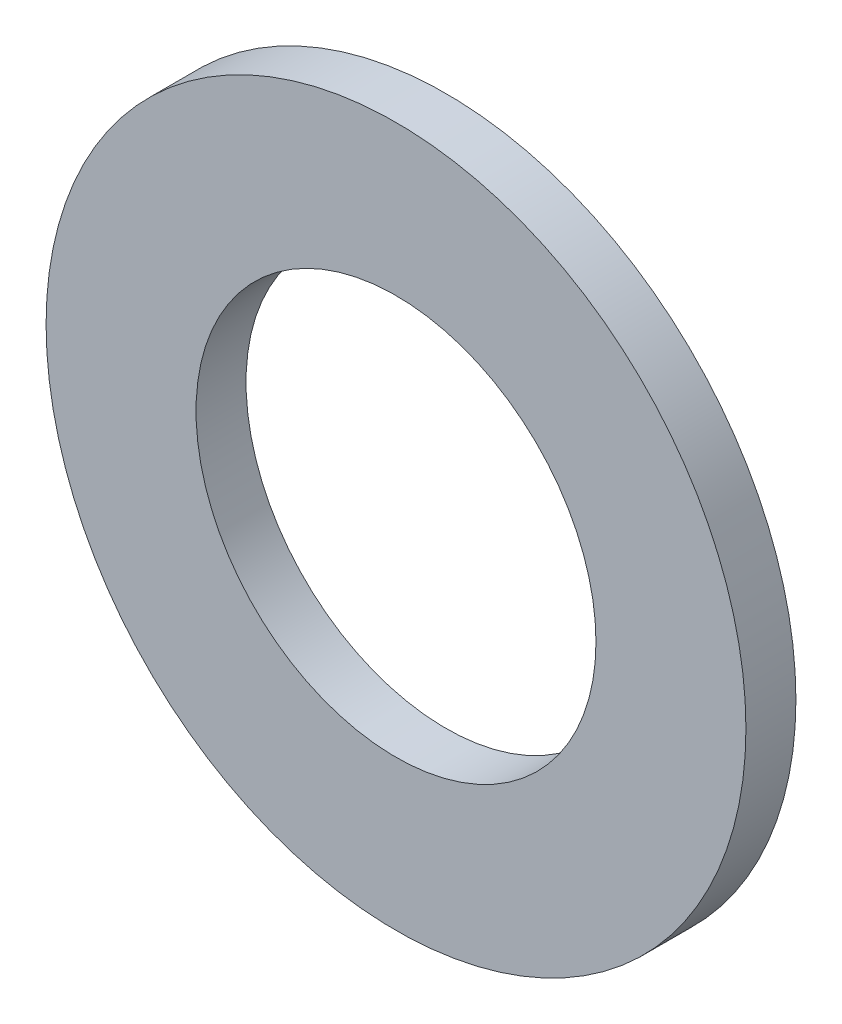
ISO-10303-21;
HEADER;
FILE_DESCRIPTION(('STEP AP214'),'2;1');
FILE_NAME('part.step','',(''),(''),'','','');
FILE_SCHEMA(('AUTOMOTIVE_DESIGN { 1 0 10303 214 1 1 1 1 }'));
ENDSEC;
DATA;
#1=APPLICATION_CONTEXT('core data for automotive mechanical design processes');
#2=APPLICATION_PROTOCOL_DEFINITION('international standard','automotive_design',2000,#1);
#3=PRODUCT_CONTEXT('',#1,'mechanical');
#4=PRODUCT('Part','Part','',(#3));
#5=PRODUCT_RELATED_PRODUCT_CATEGORY('part','',(#4));
#6=PRODUCT_DEFINITION_FORMATION('','',#4);
#7=PRODUCT_DEFINITION_CONTEXT('part definition',#1,'design');
#8=PRODUCT_DEFINITION('design','',#6,#7);
#9=PRODUCT_DEFINITION_SHAPE('','',#8);
#10=(LENGTH_UNIT() NAMED_UNIT(*) SI_UNIT(.MILLI.,.METRE.));
#11=(NAMED_UNIT(*) PLANE_ANGLE_UNIT() SI_UNIT($,.RADIAN.));
#12=(NAMED_UNIT(*) SI_UNIT($,.STERADIAN.) SOLID_ANGLE_UNIT());
#13=UNCERTAINTY_MEASURE_WITH_UNIT(LENGTH_MEASURE(1.E-05),#10,'distance_accuracy_value','');
#14=(GEOMETRIC_REPRESENTATION_CONTEXT(3) GLOBAL_UNCERTAINTY_ASSIGNED_CONTEXT((#13)) GLOBAL_UNIT_ASSIGNED_CONTEXT((#10,
#11,#12)) REPRESENTATION_CONTEXT('',''));
#15=CARTESIAN_POINT('',(0.,0.,0.));
#16=DIRECTION('',(0.,0.,1.));
#17=DIRECTION('',(1.,0.,0.));
#18=AXIS2_PLACEMENT_3D('',#15,#16,#17);
#19=CARTESIAN_POINT('',(0.,0.,0.5));
#20=DIRECTION('',(0.,0.,1.));
#21=DIRECTION('',(1.,0.,0.));
#22=AXIS2_PLACEMENT_3D('',#19,#20,#21);
#23=PLANE('',#22);
#24=CARTESIAN_POINT('',(0.,0.,0.5));
#25=DIRECTION('',(0.,0.,1.));
#26=DIRECTION('',(1.,0.,0.));
#27=AXIS2_PLACEMENT_3D('',#24,#25,#26);
#28=CIRCLE('',#27,3.5);
#29=CARTESIAN_POINT('',(3.5,0.,0.5));
#30=VERTEX_POINT('',#29);
#31=EDGE_CURVE('E10',#30,#30,#28,.T.);
#32=ORIENTED_EDGE('',*,*,#31,.T.);
#33=EDGE_LOOP('',(#32));
#34=FACE_BOUND('',#33,.T.);
#35=CARTESIAN_POINT('',(0.,0.,0.5));
#36=DIRECTION('',(0.,0.,1.));
#37=DIRECTION('',(1.,0.,0.));
#38=AXIS2_PLACEMENT_3D('',#35,#36,#37);
#39=CIRCLE('',#38,2.);
#40=CARTESIAN_POINT('',(2.,0.,0.5));
#41=VERTEX_POINT('',#40);
#42=EDGE_CURVE('E49',#41,#41,#39,.T.);
#43=ORIENTED_EDGE('',*,*,#42,.F.);
#44=EDGE_LOOP('',(#43));
#45=FACE_BOUND('',#44,.T.);
#46=ADVANCED_FACE('F38',(#34,#45),#23,.T.);
#47=CARTESIAN_POINT('',(0.,0.,0.));
#48=DIRECTION('',(0.,0.,1.));
#49=DIRECTION('',(1.,0.,0.));
#50=AXIS2_PLACEMENT_3D('',#47,#48,#49);
#51=PLANE('',#50);
#52=CARTESIAN_POINT('',(0.,0.,0.));
#53=DIRECTION('',(0.,0.,1.));
#54=DIRECTION('',(1.,0.,0.));
#55=AXIS2_PLACEMENT_3D('',#52,#53,#54);
#56=CIRCLE('',#55,3.5);
#57=CARTESIAN_POINT('',(3.5,0.,0.));
#58=VERTEX_POINT('',#57);
#59=EDGE_CURVE('E42',#58,#58,#56,.T.);
#60=ORIENTED_EDGE('',*,*,#59,.F.);
#61=EDGE_LOOP('',(#60));
#62=FACE_BOUND('',#61,.T.);
#63=CARTESIAN_POINT('',(0.,0.,0.));
#64=DIRECTION('',(0.,0.,1.));
#65=DIRECTION('',(1.,0.,0.));
#66=AXIS2_PLACEMENT_3D('',#63,#64,#65);
#67=CIRCLE('',#66,2.);
#68=CARTESIAN_POINT('',(2.,0.,0.));
#69=VERTEX_POINT('',#68);
#70=EDGE_CURVE('E51',#69,#69,#67,.T.);
#71=ORIENTED_EDGE('',*,*,#70,.T.);
#72=EDGE_LOOP('',(#71));
#73=FACE_BOUND('',#72,.T.);
#74=ADVANCED_FACE('F61',(#62,#73),#51,.F.);
#75=CARTESIAN_POINT('',(0.,0.,0.5));
#76=DIRECTION('',(0.,0.,-1.));
#77=DIRECTION('',(-1.,0.,0.));
#78=AXIS2_PLACEMENT_3D('',#75,#76,#77);
#79=CYLINDRICAL_SURFACE('',#78,3.5);
#80=ORIENTED_EDGE('',*,*,#31,.F.);
#81=EDGE_LOOP('',(#80));
#82=FACE_BOUND('',#81,.T.);
#83=ORIENTED_EDGE('',*,*,#59,.T.);
#84=EDGE_LOOP('',(#83));
#85=FACE_BOUND('',#84,.T.);
#86=ADVANCED_FACE('F40',(#82,#85),#79,.T.);
#87=CARTESIAN_POINT('',(0.,0.,0.5));
#88=DIRECTION('',(0.,0.,-1.));
#89=DIRECTION('',(-1.,0.,0.));
#90=AXIS2_PLACEMENT_3D('',#87,#88,#89);
#91=CYLINDRICAL_SURFACE('',#90,2.);
#92=ORIENTED_EDGE('',*,*,#42,.T.);
#93=EDGE_LOOP('',(#92));
#94=FACE_BOUND('',#93,.T.);
#95=ORIENTED_EDGE('',*,*,#70,.F.);
#96=EDGE_LOOP('',(#95));
#97=FACE_BOUND('',#96,.T.);
#98=ADVANCED_FACE('F57',(#94,#97),#91,.F.);
#99=CLOSED_SHELL('',(#46,#74,#86,#98));
#100=MANIFOLD_SOLID_BREP('B2',#99);
#101=ADVANCED_BREP_SHAPE_REPRESENTATION('',(#18,#100),#14);
#102=SHAPE_DEFINITION_REPRESENTATION(#9,#101);
ENDSEC;
END-ISO-10303-21;
